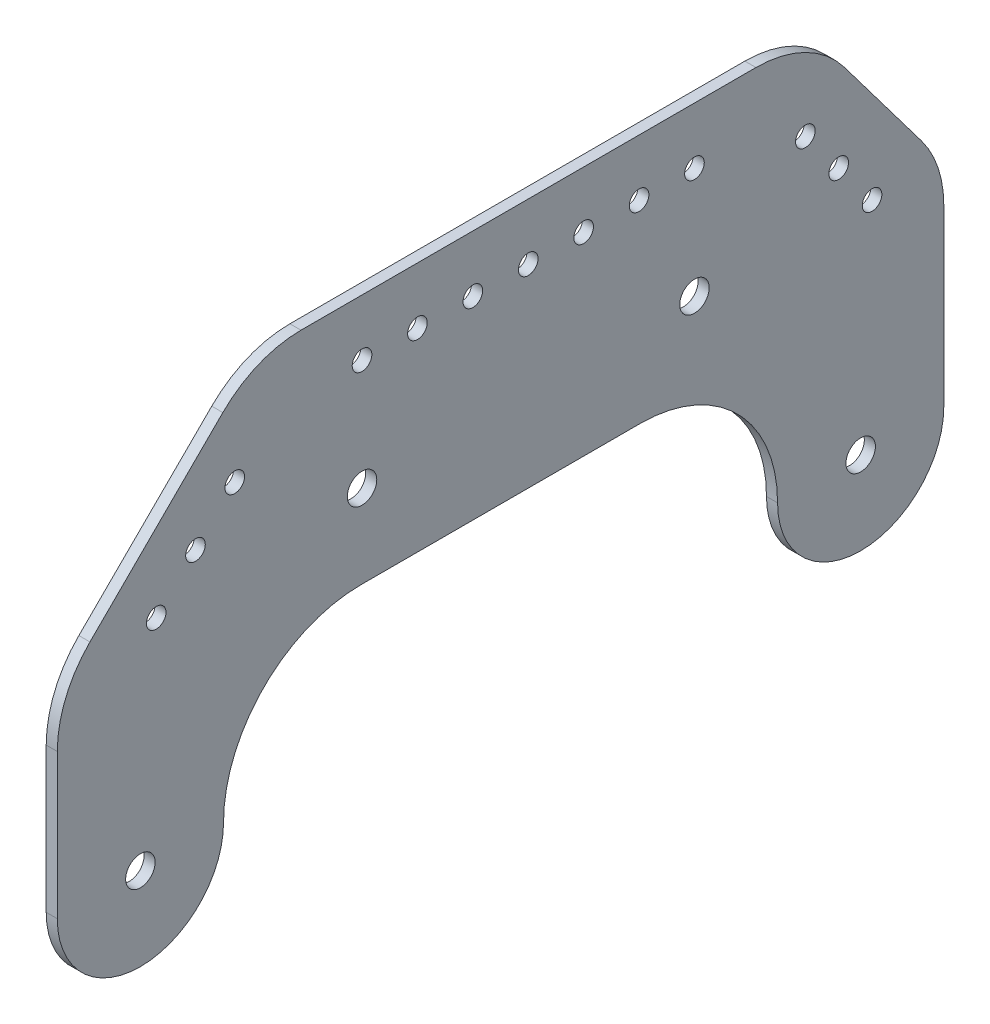
ISO-10303-21;
HEADER;
FILE_DESCRIPTION(('STEP AP214'),'2;1');
FILE_NAME('part.step','',(''),(''),'','','');
FILE_SCHEMA(('AUTOMOTIVE_DESIGN { 1 0 10303 214 1 1 1 1 }'));
ENDSEC;
DATA;
#1=APPLICATION_CONTEXT('core data for automotive mechanical design processes');
#2=APPLICATION_PROTOCOL_DEFINITION('international standard','automotive_design',2000,#1);
#3=PRODUCT_CONTEXT('',#1,'mechanical');
#4=PRODUCT('Part','Part','',(#3));
#5=PRODUCT_RELATED_PRODUCT_CATEGORY('part','',(#4));
#6=PRODUCT_DEFINITION_FORMATION('','',#4);
#7=PRODUCT_DEFINITION_CONTEXT('part definition',#1,'design');
#8=PRODUCT_DEFINITION('design','',#6,#7);
#9=PRODUCT_DEFINITION_SHAPE('','',#8);
#10=(LENGTH_UNIT() NAMED_UNIT(*) SI_UNIT(.MILLI.,.METRE.));
#11=(NAMED_UNIT(*) PLANE_ANGLE_UNIT() SI_UNIT($,.RADIAN.));
#12=(NAMED_UNIT(*) SI_UNIT($,.STERADIAN.) SOLID_ANGLE_UNIT());
#13=UNCERTAINTY_MEASURE_WITH_UNIT(LENGTH_MEASURE(1.E-05),#10,'distance_accuracy_value','');
#14=(GEOMETRIC_REPRESENTATION_CONTEXT(3) GLOBAL_UNCERTAINTY_ASSIGNED_CONTEXT((#13)) GLOBAL_UNIT_ASSIGNED_CONTEXT((#10,
#11,#12)) REPRESENTATION_CONTEXT('',''));
#15=CARTESIAN_POINT('',(0.,0.,0.));
#16=DIRECTION('',(0.,0.,1.));
#17=DIRECTION('',(1.,0.,0.));
#18=AXIS2_PLACEMENT_3D('',#15,#16,#17);
#19=CARTESIAN_POINT('',(0.,33.1917508430703,-6.34999999999999));
#20=DIRECTION('',(1.,0.,0.));
#21=DIRECTION('',(0.,0.,-1.));
#22=AXIS2_PLACEMENT_3D('',#19,#20,#21);
#23=PLANE('',#22);
#24=CARTESIAN_POINT('',(0.,75.946,-88.9));
#25=DIRECTION('',(1.,0.,0.));
#26=DIRECTION('',(0.,0.,-1.));
#27=AXIS2_PLACEMENT_3D('',#24,#25,#26);
#28=CIRCLE('',#27,2.2479);
#29=CARTESIAN_POINT('',(0.,75.946,-91.1479));
#30=VERTEX_POINT('',#29);
#31=EDGE_CURVE('E606',#30,#30,#28,.F.);
#32=ORIENTED_EDGE('',*,*,#31,.F.);
#33=EDGE_LOOP('',(#32));
#34=FACE_BOUND('',#33,.T.);
#35=CARTESIAN_POINT('',(0.,75.946,-101.6));
#36=DIRECTION('',(1.,0.,0.));
#37=DIRECTION('',(0.,0.,-1.));
#38=AXIS2_PLACEMENT_3D('',#35,#36,#37);
#39=CIRCLE('',#38,2.2479);
#40=CARTESIAN_POINT('',(0.,75.946,-103.8479));
#41=VERTEX_POINT('',#40);
#42=EDGE_CURVE('E612',#41,#41,#39,.F.);
#43=ORIENTED_EDGE('',*,*,#42,.F.);
#44=EDGE_LOOP('',(#43));
#45=FACE_BOUND('',#44,.T.);
#46=CARTESIAN_POINT('',(0.,48.3908890953049,-3.61982012414171));
#47=DIRECTION('',(1.,0.,0.));
#48=DIRECTION('',(0.,0.,-1.));
#49=AXIS2_PLACEMENT_3D('',#46,#47,#48);
#50=CIRCLE('',#49,2.2479);
#51=CARTESIAN_POINT('',(0.,48.3908890953049,-5.86772012414171));
#52=VERTEX_POINT('',#51);
#53=EDGE_CURVE('E630',#52,#52,#50,.F.);
#54=ORIENTED_EDGE('',*,*,#53,.F.);
#55=EDGE_LOOP('',(#54));
#56=FACE_BOUND('',#55,.T.);
#57=CARTESIAN_POINT('',(0.,69.5724765499946,-152.417846486706));
#58=DIRECTION('',(1.,0.,0.));
#59=DIRECTION('',(0.,0.,-1.));
#60=AXIS2_PLACEMENT_3D('',#57,#58,#59);
#61=CIRCLE('',#60,2.2479);
#62=CARTESIAN_POINT('',(0.,69.5724765499946,-154.665746486706));
#63=VERTEX_POINT('',#62);
#64=EDGE_CURVE('E637',#63,#63,#61,.F.);
#65=ORIENTED_EDGE('',*,*,#64,.F.);
#66=EDGE_LOOP('',(#65));
#67=FACE_BOUND('',#66,.T.);
#68=CARTESIAN_POINT('',(0.,59.4308526551306,-160.062286608462));
#69=DIRECTION('',(1.,0.,0.));
#70=DIRECTION('',(0.,0.,-1.));
#71=AXIS2_PLACEMENT_3D('',#68,#69,#70);
#72=CIRCLE('',#71,2.2479);
#73=CARTESIAN_POINT('',(0.,59.4308526551306,-162.310186608462));
#74=VERTEX_POINT('',#73);
#75=EDGE_CURVE('E643',#74,#74,#72,.F.);
#76=ORIENTED_EDGE('',*,*,#75,.F.);
#77=EDGE_LOOP('',(#76));
#78=FACE_BOUND('',#77,.T.);
#79=CARTESIAN_POINT('',(0.,49.2892287602667,-167.706726730219));
#80=DIRECTION('',(1.,0.,0.));
#81=DIRECTION('',(0.,0.,-1.));
#82=AXIS2_PLACEMENT_3D('',#79,#80,#81);
#83=CIRCLE('',#82,2.2479);
#84=CARTESIAN_POINT('',(0.,49.2892287602667,-169.954626730219));
#85=VERTEX_POINT('',#84);
#86=EDGE_CURVE('E649',#85,#85,#83,.F.);
#87=ORIENTED_EDGE('',*,*,#86,.F.);
#88=EDGE_LOOP('',(#87));
#89=FACE_BOUND('',#88,.T.);
#90=CARTESIAN_POINT('',(0.,75.946,-63.5));
#91=DIRECTION('',(1.,0.,0.));
#92=DIRECTION('',(0.,0.,-1.));
#93=AXIS2_PLACEMENT_3D('',#90,#91,#92);
#94=CIRCLE('',#93,2.2479);
#95=CARTESIAN_POINT('',(0.,75.946,-65.7479));
#96=VERTEX_POINT('',#95);
#97=EDGE_CURVE('E655',#96,#96,#94,.F.);
#98=ORIENTED_EDGE('',*,*,#97,.F.);
#99=EDGE_LOOP('',(#98));
#100=FACE_BOUND('',#99,.T.);
#101=CARTESIAN_POINT('',(0.,75.9460000000001,-50.8));
#102=DIRECTION('',(1.,0.,0.));
#103=DIRECTION('',(0.,0.,-1.));
#104=AXIS2_PLACEMENT_3D('',#101,#102,#103);
#105=CIRCLE('',#104,2.2479);
#106=CARTESIAN_POINT('',(0.,75.9460000000001,-53.0479));
#107=VERTEX_POINT('',#106);
#108=EDGE_CURVE('E661',#107,#107,#105,.F.);
#109=ORIENTED_EDGE('',*,*,#108,.F.);
#110=EDGE_LOOP('',(#109));
#111=FACE_BOUND('',#110,.T.);
#112=CARTESIAN_POINT('',(0.,75.946,-114.3));
#113=DIRECTION('',(1.,0.,0.));
#114=DIRECTION('',(0.,0.,-1.));
#115=AXIS2_PLACEMENT_3D('',#112,#113,#114);
#116=CIRCLE('',#115,2.2479);
#117=CARTESIAN_POINT('',(0.,75.946,-116.5479));
#118=VERTEX_POINT('',#117);
#119=EDGE_CURVE('E667',#118,#118,#116,.F.);
#120=ORIENTED_EDGE('',*,*,#119,.F.);
#121=EDGE_LOOP('',(#120));
#122=FACE_BOUND('',#121,.T.);
#123=CARTESIAN_POINT('',(0.,75.9460000000001,-127.));
#124=DIRECTION('',(1.,0.,0.));
#125=DIRECTION('',(0.,0.,-1.));
#126=AXIS2_PLACEMENT_3D('',#123,#124,#125);
#127=CIRCLE('',#126,2.2479);
#128=CARTESIAN_POINT('',(0.,75.9460000000001,-129.2479));
#129=VERTEX_POINT('',#128);
#130=EDGE_CURVE('E673',#129,#129,#127,.F.);
#131=ORIENTED_EDGE('',*,*,#130,.F.);
#132=EDGE_LOOP('',(#131));
#133=FACE_BOUND('',#132,.T.);
#134=CARTESIAN_POINT('',(0.,50.546,-50.8));
#135=DIRECTION('',(1.,0.,0.));
#136=DIRECTION('',(0.,0.,-1.));
#137=AXIS2_PLACEMENT_3D('',#134,#135,#136);
#138=CIRCLE('',#137,3.3782);
#139=CARTESIAN_POINT('',(0.,50.546,-54.1782));
#140=VERTEX_POINT('',#139);
#141=EDGE_CURVE('E681',#140,#140,#138,.T.);
#142=ORIENTED_EDGE('',*,*,#141,.T.);
#143=EDGE_LOOP('',(#142));
#144=FACE_BOUND('',#143,.T.);
#145=CARTESIAN_POINT('',(0.,50.546,-127.));
#146=DIRECTION('',(1.,0.,0.));
#147=DIRECTION('',(0.,0.,-1.));
#148=AXIS2_PLACEMENT_3D('',#145,#146,#147);
#149=CIRCLE('',#148,3.3782);
#150=CARTESIAN_POINT('',(0.,50.546,-130.3782));
#151=VERTEX_POINT('',#150);
#152=EDGE_CURVE('E689',#151,#151,#149,.T.);
#153=ORIENTED_EDGE('',*,*,#152,.T.);
#154=EDGE_LOOP('',(#153));
#155=FACE_BOUND('',#154,.T.);
#156=CARTESIAN_POINT('',(0.,1.38777878078145E-13,-165.1));
#157=DIRECTION('',(1.,0.,0.));
#158=DIRECTION('',(0.,0.,-1.));
#159=AXIS2_PLACEMENT_3D('',#156,#157,#158);
#160=CIRCLE('',#159,3.3782);
#161=CARTESIAN_POINT('',(0.,1.38777878078145E-13,-168.4782));
#162=VERTEX_POINT('',#161);
#163=EDGE_CURVE('E695',#162,#162,#160,.T.);
#164=ORIENTED_EDGE('',*,*,#163,.T.);
#165=EDGE_LOOP('',(#164));
#166=FACE_BOUND('',#165,.T.);
#167=CARTESIAN_POINT('',(0.,0.,0.));
#168=DIRECTION('',(1.,0.,0.));
#169=DIRECTION('',(0.,0.,-1.));
#170=AXIS2_PLACEMENT_3D('',#167,#168,#169);
#171=CIRCLE('',#170,3.3782);
#172=CARTESIAN_POINT('',(0.,0.,-3.3782));
#173=VERTEX_POINT('',#172);
#174=EDGE_CURVE('E184',#173,#173,#171,.T.);
#175=ORIENTED_EDGE('',*,*,#174,.T.);
#176=EDGE_LOOP('',(#175));
#177=FACE_BOUND('',#176,.T.);
#178=DIRECTION('',(0.,1.,0.));
#179=VECTOR('',#178,1.);
#180=CARTESIAN_POINT('',(0.,0.,19.05));
#181=LINE('',#180,#179);
#182=CARTESIAN_POINT('',(0.,0.,19.05));
#183=VERTEX_POINT('',#182);
#184=CARTESIAN_POINT('',(0.,33.1917508430702,19.05));
#185=VERTEX_POINT('',#184);
#186=EDGE_CURVE('E180',#183,#185,#181,.T.);
#187=ORIENTED_EDGE('',*,*,#186,.T.);
#188=CARTESIAN_POINT('',(0.,33.1917508430703,-6.34999999999999));
#189=DIRECTION('',(1.,0.,0.));
#190=DIRECTION('',(0.,0.,-1.));
#191=AXIS2_PLACEMENT_3D('',#188,#189,#190);
#192=CIRCLE('',#191,25.4);
#193=CARTESIAN_POINT('',(0.,51.1972203509545,11.5654421603446));
#194=VERTEX_POINT('',#193);
#195=EDGE_CURVE('E183',#194,#185,#192,.T.);
#196=ORIENTED_EDGE('',*,*,#195,.F.);
#197=DIRECTION('',(0.,0.705332368517507,-0.708876752278902));
#198=VECTOR('',#197,1.);
#199=CARTESIAN_POINT('',(0.,51.1972203509545,11.5654421603446));
#200=LINE('',#199,#198);
#201=CARTESIAN_POINT('',(0.,81.505469507884,-18.8951097561674));
#202=VERTEX_POINT('',#201);
#203=EDGE_CURVE('E187',#194,#202,#200,.T.);
#204=ORIENTED_EDGE('',*,*,#203,.T.);
#205=CARTESIAN_POINT('',(0.,63.5,-36.8105519165122));
#206=DIRECTION('',(-1.,0.,0.));
#207=DIRECTION('',(0.,0.,1.));
#208=AXIS2_PLACEMENT_3D('',#205,#206,#207);
#209=CIRCLE('',#208,25.4);
#210=CARTESIAN_POINT('',(0.,88.9,-36.8105519165123));
#211=VERTEX_POINT('',#210);
#212=EDGE_CURVE('E190',#202,#211,#209,.T.);
#213=ORIENTED_EDGE('',*,*,#212,.T.);
#214=DIRECTION('',(0.,0.,-1.));
#215=VECTOR('',#214,1.);
#216=CARTESIAN_POINT('',(0.,88.9,-36.8105519165123));
#217=LINE('',#216,#215);
#218=CARTESIAN_POINT('',(0.,88.9,-141.091325427197));
#219=VERTEX_POINT('',#218);
#220=EDGE_CURVE('E193',#211,#219,#217,.T.);
#221=ORIENTED_EDGE('',*,*,#220,.T.);
#222=CARTESIAN_POINT('',(0.,63.5,-141.091325427197));
#223=DIRECTION('',(1.,0.,0.));
#224=DIRECTION('',(0.,0.,-1.));
#225=AXIS2_PLACEMENT_3D('',#222,#223,#224);
#226=CIRCLE('',#225,25.4);
#227=CARTESIAN_POINT('',(0.,78.7888802435134,-161.374573216925));
#228=VERTEX_POINT('',#227);
#229=EDGE_CURVE('E196',#228,#219,#226,.T.);
#230=ORIENTED_EDGE('',*,*,#229,.F.);
#231=DIRECTION('',(0.,-0.798553062587712,-0.601924419035966));
#232=VECTOR('',#231,1.);
#233=CARTESIAN_POINT('',(0.,78.7888802435134,-161.374573216925));
#234=LINE('',#233,#232);
#235=CARTESIAN_POINT('',(0.,55.3617053102614,-179.033247789728));
#236=VERTEX_POINT('',#235);
#237=EDGE_CURVE('E199',#228,#236,#234,.T.);
#238=ORIENTED_EDGE('',*,*,#237,.T.);
#239=CARTESIAN_POINT('',(0.,40.0728250667478,-158.75));
#240=DIRECTION('',(-1.,0.,0.));
#241=DIRECTION('',(0.,0.,1.));
#242=AXIS2_PLACEMENT_3D('',#239,#240,#241);
#243=CIRCLE('',#242,25.4);
#244=CARTESIAN_POINT('',(0.,40.0728250667477,-184.15));
#245=VERTEX_POINT('',#244);
#246=EDGE_CURVE('E202',#236,#245,#243,.T.);
#247=ORIENTED_EDGE('',*,*,#246,.T.);
#248=DIRECTION('',(0.,-1.,0.));
#249=VECTOR('',#248,1.);
#250=CARTESIAN_POINT('',(0.,40.0728250667477,-184.15));
#251=LINE('',#250,#249);
#252=CARTESIAN_POINT('',(0.,1.38777878078145E-13,-184.15));
#253=VERTEX_POINT('',#252);
#254=EDGE_CURVE('E205',#245,#253,#251,.T.);
#255=ORIENTED_EDGE('',*,*,#254,.T.);
#256=CARTESIAN_POINT('',(0.,1.38777878078145E-13,-165.1));
#257=DIRECTION('',(1.,0.,0.));
#258=DIRECTION('',(0.,0.,-1.));
#259=AXIS2_PLACEMENT_3D('',#256,#257,#258);
#260=CIRCLE('',#259,19.05);
#261=CARTESIAN_POINT('',(0.,0.,-146.05));
#262=VERTEX_POINT('',#261);
#263=EDGE_CURVE('E208',#262,#253,#260,.T.);
#264=ORIENTED_EDGE('',*,*,#263,.F.);
#265=CARTESIAN_POINT('',(0.,-2.61325812841072E-13,-114.554));
#266=DIRECTION('',(1.,0.,0.));
#267=DIRECTION('',(0.,0.,-1.));
#268=AXIS2_PLACEMENT_3D('',#265,#266,#267);
#269=CIRCLE('',#268,31.4960000000003);
#270=CARTESIAN_POINT('',(0.,31.496,-114.554));
#271=VERTEX_POINT('',#270);
#272=EDGE_CURVE('E212',#262,#271,#269,.T.);
#273=ORIENTED_EDGE('',*,*,#272,.T.);
#274=DIRECTION('',(0.,0.,-1.));
#275=VECTOR('',#274,1.);
#276=CARTESIAN_POINT('',(0.,31.496,-50.546));
#277=LINE('',#276,#275);
#278=CARTESIAN_POINT('',(0.,31.496,-50.546));
#279=VERTEX_POINT('',#278);
#280=EDGE_CURVE('E216',#279,#271,#277,.T.);
#281=ORIENTED_EDGE('',*,*,#280,.F.);
#282=CARTESIAN_POINT('',(0.,0.,-50.546));
#283=DIRECTION('',(1.,0.,0.));
#284=DIRECTION('',(0.,0.,-1.));
#285=AXIS2_PLACEMENT_3D('',#282,#283,#284);
#286=CIRCLE('',#285,31.496);
#287=CARTESIAN_POINT('',(0.,0.,-19.05));
#288=VERTEX_POINT('',#287);
#289=EDGE_CURVE('E157',#279,#288,#286,.T.);
#290=ORIENTED_EDGE('',*,*,#289,.T.);
#291=CARTESIAN_POINT('',(0.,0.,0.));
#292=DIRECTION('',(1.,0.,0.));
#293=DIRECTION('',(0.,0.,-1.));
#294=AXIS2_PLACEMENT_3D('',#291,#292,#293);
#295=CIRCLE('',#294,19.05);
#296=EDGE_CURVE('E220',#183,#288,#295,.T.);
#297=ORIENTED_EDGE('',*,*,#296,.F.);
#298=EDGE_LOOP('',(#187,#196,#204,#213,#221,#230,#238,#247,#255,#264,#273,#281,#290,#297));
#299=FACE_BOUND('',#298,.T.);
#300=CARTESIAN_POINT('',(0.,57.3486101754772,-12.6225548780838));
#301=DIRECTION('',(1.,0.,0.));
#302=DIRECTION('',(0.,0.,-1.));
#303=AXIS2_PLACEMENT_3D('',#300,#301,#302);
#304=CIRCLE('',#303,2.2479);
#305=CARTESIAN_POINT('',(0.,57.3486101754772,-14.8704548780838));
#306=VERTEX_POINT('',#305);
#307=EDGE_CURVE('E624',#306,#306,#304,.F.);
#308=ORIENTED_EDGE('',*,*,#307,.F.);
#309=EDGE_LOOP('',(#308));
#310=FACE_BOUND('',#309,.T.);
#311=CARTESIAN_POINT('',(0.,66.3063312556496,-21.6252896320258));
#312=DIRECTION('',(1.,0.,0.));
#313=DIRECTION('',(0.,0.,-1.));
#314=AXIS2_PLACEMENT_3D('',#311,#312,#313);
#315=CIRCLE('',#314,2.2479);
#316=CARTESIAN_POINT('',(0.,66.3063312556496,-23.8731896320258));
#317=VERTEX_POINT('',#316);
#318=EDGE_CURVE('E618',#317,#317,#315,.F.);
#319=ORIENTED_EDGE('',*,*,#318,.F.);
#320=EDGE_LOOP('',(#319));
#321=FACE_BOUND('',#320,.T.);
#322=CARTESIAN_POINT('',(0.,75.946,-76.2));
#323=DIRECTION('',(1.,0.,0.));
#324=DIRECTION('',(0.,0.,-1.));
#325=AXIS2_PLACEMENT_3D('',#322,#323,#324);
#326=CIRCLE('',#325,2.2479);
#327=CARTESIAN_POINT('',(0.,75.946,-78.4479));
#328=VERTEX_POINT('',#327);
#329=EDGE_CURVE('E598',#328,#328,#326,.F.);
#330=ORIENTED_EDGE('',*,*,#329,.F.);
#331=EDGE_LOOP('',(#330));
#332=FACE_BOUND('',#331,.T.);
#333=ADVANCED_FACE('F41',(#34,#45,#56,#67,#78,#89,#100,#111,#122,#133,#144,#155,#166,#177,#299,
#310,#321,#332),#23,.F.);
#334=CARTESIAN_POINT('',(2.54,0.,19.05));
#335=DIRECTION('',(0.,0.,1.));
#336=DIRECTION('',(1.,0.,0.));
#337=AXIS2_PLACEMENT_3D('',#334,#335,#336);
#338=PLANE('',#337);
#339=ORIENTED_EDGE('',*,*,#186,.F.);
#340=DIRECTION('',(-1.,0.,0.));
#341=VECTOR('',#340,1.);
#342=CARTESIAN_POINT('',(2.54,0.,19.05));
#343=LINE('',#342,#341);
#344=CARTESIAN_POINT('',(2.54,0.,19.05));
#345=VERTEX_POINT('',#344);
#346=EDGE_CURVE('E11',#345,#183,#343,.T.);
#347=ORIENTED_EDGE('',*,*,#346,.F.);
#348=DIRECTION('',(0.,1.,0.));
#349=VECTOR('',#348,1.);
#350=CARTESIAN_POINT('',(2.54,0.,19.05));
#351=LINE('',#350,#349);
#352=CARTESIAN_POINT('',(2.54,33.1917508430702,19.05));
#353=VERTEX_POINT('',#352);
#354=EDGE_CURVE('E221',#345,#353,#351,.T.);
#355=ORIENTED_EDGE('',*,*,#354,.T.);
#356=DIRECTION('',(-1.,0.,0.));
#357=VECTOR('',#356,1.);
#358=CARTESIAN_POINT('',(2.54,33.1917508430702,19.05));
#359=LINE('',#358,#357);
#360=EDGE_CURVE('E45',#353,#185,#359,.T.);
#361=ORIENTED_EDGE('',*,*,#360,.T.);
#362=EDGE_LOOP('',(#339,#347,#355,#361));
#363=FACE_BOUND('',#362,.T.);
#364=ADVANCED_FACE('F43',(#363),#338,.T.);
#365=CARTESIAN_POINT('',(2.54,0.,0.));
#366=DIRECTION('',(-1.,0.,0.));
#367=DIRECTION('',(0.,0.,1.));
#368=AXIS2_PLACEMENT_3D('',#365,#366,#367);
#369=CYLINDRICAL_SURFACE('',#368,19.05);
#370=ORIENTED_EDGE('',*,*,#296,.T.);
#371=DIRECTION('',(-1.,0.,0.));
#372=VECTOR('',#371,1.);
#373=CARTESIAN_POINT('',(2.54,0.,-19.05));
#374=LINE('',#373,#372);
#375=CARTESIAN_POINT('',(2.54,0.,-19.05));
#376=VERTEX_POINT('',#375);
#377=EDGE_CURVE('E51',#376,#288,#374,.T.);
#378=ORIENTED_EDGE('',*,*,#377,.F.);
#379=CARTESIAN_POINT('',(2.54,0.,0.));
#380=DIRECTION('',(1.,0.,0.));
#381=DIRECTION('',(0.,0.,-1.));
#382=AXIS2_PLACEMENT_3D('',#379,#380,#381);
#383=CIRCLE('',#382,19.05);
#384=EDGE_CURVE('E171',#345,#376,#383,.T.);
#385=ORIENTED_EDGE('',*,*,#384,.F.);
#386=ORIENTED_EDGE('',*,*,#346,.T.);
#387=EDGE_LOOP('',(#370,#378,#385,#386));
#388=FACE_BOUND('',#387,.T.);
#389=ADVANCED_FACE('F248',(#388),#369,.T.);
#390=CARTESIAN_POINT('',(2.54,0.,-50.546));
#391=DIRECTION('',(-1.,0.,0.));
#392=DIRECTION('',(0.,0.,1.));
#393=AXIS2_PLACEMENT_3D('',#390,#391,#392);
#394=CYLINDRICAL_SURFACE('',#393,31.496);
#395=ORIENTED_EDGE('',*,*,#289,.F.);
#396=DIRECTION('',(-1.,0.,0.));
#397=VECTOR('',#396,1.);
#398=CARTESIAN_POINT('',(2.54,31.496,-50.546));
#399=LINE('',#398,#397);
#400=CARTESIAN_POINT('',(2.54,31.496,-50.546));
#401=VERTEX_POINT('',#400);
#402=EDGE_CURVE('E151',#401,#279,#399,.T.);
#403=ORIENTED_EDGE('',*,*,#402,.F.);
#404=CARTESIAN_POINT('',(2.54,0.,-50.546));
#405=DIRECTION('',(1.,0.,0.));
#406=DIRECTION('',(0.,0.,-1.));
#407=AXIS2_PLACEMENT_3D('',#404,#405,#406);
#408=CIRCLE('',#407,31.496);
#409=EDGE_CURVE('E155',#401,#376,#408,.T.);
#410=ORIENTED_EDGE('',*,*,#409,.T.);
#411=ORIENTED_EDGE('',*,*,#377,.T.);
#412=EDGE_LOOP('',(#395,#403,#410,#411));
#413=FACE_BOUND('',#412,.T.);
#414=ADVANCED_FACE('F153',(#413),#394,.F.);
#415=CARTESIAN_POINT('',(2.54,31.496,-50.546));
#416=DIRECTION('',(0.,1.,0.));
#417=DIRECTION('',(0.,0.,1.));
#418=AXIS2_PLACEMENT_3D('',#415,#416,#417);
#419=PLANE('',#418);
#420=ORIENTED_EDGE('',*,*,#280,.T.);
#421=DIRECTION('',(-1.,0.,0.));
#422=VECTOR('',#421,1.);
#423=CARTESIAN_POINT('',(2.54,31.496,-114.554));
#424=LINE('',#423,#422);
#425=CARTESIAN_POINT('',(2.54,31.496,-114.554));
#426=VERTEX_POINT('',#425);
#427=EDGE_CURVE('E161',#426,#271,#424,.T.);
#428=ORIENTED_EDGE('',*,*,#427,.F.);
#429=DIRECTION('',(0.,0.,-1.));
#430=VECTOR('',#429,1.);
#431=CARTESIAN_POINT('',(2.54,31.496,-50.546));
#432=LINE('',#431,#430);
#433=EDGE_CURVE('E164',#401,#426,#432,.T.);
#434=ORIENTED_EDGE('',*,*,#433,.F.);
#435=ORIENTED_EDGE('',*,*,#402,.T.);
#436=EDGE_LOOP('',(#420,#428,#434,#435));
#437=FACE_BOUND('',#436,.T.);
#438=ADVANCED_FACE('F165',(#437),#419,.F.);
#439=CARTESIAN_POINT('',(2.54,-2.61325812841072E-13,-114.554));
#440=DIRECTION('',(-1.,0.,0.));
#441=DIRECTION('',(0.,0.,1.));
#442=AXIS2_PLACEMENT_3D('',#439,#440,#441);
#443=CYLINDRICAL_SURFACE('',#442,31.4960000000003);
#444=ORIENTED_EDGE('',*,*,#272,.F.);
#445=DIRECTION('',(-1.,0.,0.));
#446=VECTOR('',#445,1.);
#447=CARTESIAN_POINT('',(2.54,0.,-146.05));
#448=LINE('',#447,#446);
#449=CARTESIAN_POINT('',(2.54,0.,-146.05));
#450=VERTEX_POINT('',#449);
#451=EDGE_CURVE('E225',#450,#262,#448,.T.);
#452=ORIENTED_EDGE('',*,*,#451,.F.);
#453=CARTESIAN_POINT('',(2.54,-2.61325812841072E-13,-114.554));
#454=DIRECTION('',(1.,0.,0.));
#455=DIRECTION('',(0.,0.,-1.));
#456=AXIS2_PLACEMENT_3D('',#453,#454,#455);
#457=CIRCLE('',#456,31.4960000000003);
#458=EDGE_CURVE('E168',#450,#426,#457,.T.);
#459=ORIENTED_EDGE('',*,*,#458,.T.);
#460=ORIENTED_EDGE('',*,*,#427,.T.);
#461=EDGE_LOOP('',(#444,#452,#459,#460));
#462=FACE_BOUND('',#461,.T.);
#463=ADVANCED_FACE('F281',(#462),#443,.F.);
#464=CARTESIAN_POINT('',(2.54,1.38777878078145E-13,-165.1));
#465=DIRECTION('',(-1.,0.,0.));
#466=DIRECTION('',(0.,0.,1.));
#467=AXIS2_PLACEMENT_3D('',#464,#465,#466);
#468=CYLINDRICAL_SURFACE('',#467,19.05);
#469=ORIENTED_EDGE('',*,*,#263,.T.);
#470=DIRECTION('',(-1.,0.,0.));
#471=VECTOR('',#470,1.);
#472=CARTESIAN_POINT('',(2.54,1.38777878078145E-13,-184.15));
#473=LINE('',#472,#471);
#474=CARTESIAN_POINT('',(2.54,1.38777878078145E-13,-184.15));
#475=VERTEX_POINT('',#474);
#476=EDGE_CURVE('E228',#475,#253,#473,.T.);
#477=ORIENTED_EDGE('',*,*,#476,.F.);
#478=CARTESIAN_POINT('',(2.54,1.38777878078145E-13,-165.1));
#479=DIRECTION('',(1.,0.,0.));
#480=DIRECTION('',(0.,0.,-1.));
#481=AXIS2_PLACEMENT_3D('',#478,#479,#480);
#482=CIRCLE('',#481,19.05);
#483=EDGE_CURVE('E274',#450,#475,#482,.T.);
#484=ORIENTED_EDGE('',*,*,#483,.F.);
#485=ORIENTED_EDGE('',*,*,#451,.T.);
#486=EDGE_LOOP('',(#469,#477,#484,#485));
#487=FACE_BOUND('',#486,.T.);
#488=ADVANCED_FACE('F287',(#487),#468,.T.);
#489=CARTESIAN_POINT('',(2.54,40.0728250667477,-184.15));
#490=DIRECTION('',(0.,0.,-1.));
#491=DIRECTION('',(0.,1.,0.));
#492=AXIS2_PLACEMENT_3D('',#489,#490,#491);
#493=PLANE('',#492);
#494=ORIENTED_EDGE('',*,*,#254,.F.);
#495=DIRECTION('',(-1.,0.,0.));
#496=VECTOR('',#495,1.);
#497=CARTESIAN_POINT('',(2.54,40.0728250667477,-184.15));
#498=LINE('',#497,#496);
#499=CARTESIAN_POINT('',(2.54,40.0728250667477,-184.15));
#500=VERTEX_POINT('',#499);
#501=EDGE_CURVE('E230',#500,#245,#498,.T.);
#502=ORIENTED_EDGE('',*,*,#501,.F.);
#503=DIRECTION('',(0.,-1.,0.));
#504=VECTOR('',#503,1.);
#505=CARTESIAN_POINT('',(2.54,40.0728250667477,-184.15));
#506=LINE('',#505,#504);
#507=EDGE_CURVE('E271',#500,#475,#506,.T.);
#508=ORIENTED_EDGE('',*,*,#507,.T.);
#509=ORIENTED_EDGE('',*,*,#476,.T.);
#510=EDGE_LOOP('',(#494,#502,#508,#509));
#511=FACE_BOUND('',#510,.T.);
#512=ADVANCED_FACE('F291',(#511),#493,.T.);
#513=CARTESIAN_POINT('',(2.54,40.0728250667478,-158.75));
#514=DIRECTION('',(-1.,0.,0.));
#515=DIRECTION('',(0.,0.,1.));
#516=AXIS2_PLACEMENT_3D('',#513,#514,#515);
#517=CYLINDRICAL_SURFACE('',#516,25.4);
#518=ORIENTED_EDGE('',*,*,#246,.F.);
#519=DIRECTION('',(-1.,0.,0.));
#520=VECTOR('',#519,1.);
#521=CARTESIAN_POINT('',(2.54,55.3617053102614,-179.033247789728));
#522=LINE('',#521,#520);
#523=CARTESIAN_POINT('',(2.54,55.3617053102614,-179.033247789728));
#524=VERTEX_POINT('',#523);
#525=EDGE_CURVE('E232',#524,#236,#522,.T.);
#526=ORIENTED_EDGE('',*,*,#525,.F.);
#527=CARTESIAN_POINT('',(2.54,40.0728250667478,-158.75));
#528=DIRECTION('',(-1.,0.,0.));
#529=DIRECTION('',(0.,0.,1.));
#530=AXIS2_PLACEMENT_3D('',#527,#528,#529);
#531=CIRCLE('',#530,25.4);
#532=EDGE_CURVE('E268',#524,#500,#531,.T.);
#533=ORIENTED_EDGE('',*,*,#532,.T.);
#534=ORIENTED_EDGE('',*,*,#501,.T.);
#535=EDGE_LOOP('',(#518,#526,#533,#534));
#536=FACE_BOUND('',#535,.T.);
#537=ADVANCED_FACE('F294',(#536),#517,.T.);
#538=CARTESIAN_POINT('',(2.54,78.7888802435134,-161.374573216925));
#539=DIRECTION('',(0.,0.601924419035966,-0.798553062587712));
#540=DIRECTION('',(0.,0.798553062587712,0.601924419035966));
#541=AXIS2_PLACEMENT_3D('',#538,#539,#540);
#542=PLANE('',#541);
#543=ORIENTED_EDGE('',*,*,#237,.F.);
#544=DIRECTION('',(-1.,0.,0.));
#545=VECTOR('',#544,1.);
#546=CARTESIAN_POINT('',(2.54,78.7888802435134,-161.374573216925));
#547=LINE('',#546,#545);
#548=CARTESIAN_POINT('',(2.54,78.7888802435134,-161.374573216925));
#549=VERTEX_POINT('',#548);
#550=EDGE_CURVE('E234',#549,#228,#547,.T.);
#551=ORIENTED_EDGE('',*,*,#550,.F.);
#552=DIRECTION('',(0.,-0.798553062587712,-0.601924419035966));
#553=VECTOR('',#552,1.);
#554=CARTESIAN_POINT('',(2.54,78.7888802435134,-161.374573216925));
#555=LINE('',#554,#553);
#556=EDGE_CURVE('E265',#549,#524,#555,.T.);
#557=ORIENTED_EDGE('',*,*,#556,.T.);
#558=ORIENTED_EDGE('',*,*,#525,.T.);
#559=EDGE_LOOP('',(#543,#551,#557,#558));
#560=FACE_BOUND('',#559,.T.);
#561=ADVANCED_FACE('F298',(#560),#542,.T.);
#562=CARTESIAN_POINT('',(2.54,63.5,-141.091325427197));
#563=DIRECTION('',(-1.,0.,0.));
#564=DIRECTION('',(0.,0.,1.));
#565=AXIS2_PLACEMENT_3D('',#562,#563,#564);
#566=CYLINDRICAL_SURFACE('',#565,25.4);
#567=ORIENTED_EDGE('',*,*,#229,.T.);
#568=DIRECTION('',(-1.,0.,0.));
#569=VECTOR('',#568,1.);
#570=CARTESIAN_POINT('',(2.54,88.9,-141.091325427197));
#571=LINE('',#570,#569);
#572=CARTESIAN_POINT('',(2.54,88.9,-141.091325427197));
#573=VERTEX_POINT('',#572);
#574=EDGE_CURVE('E236',#573,#219,#571,.T.);
#575=ORIENTED_EDGE('',*,*,#574,.F.);
#576=CARTESIAN_POINT('',(2.54,63.5,-141.091325427197));
#577=DIRECTION('',(1.,0.,0.));
#578=DIRECTION('',(0.,0.,-1.));
#579=AXIS2_PLACEMENT_3D('',#576,#577,#578);
#580=CIRCLE('',#579,25.4);
#581=EDGE_CURVE('E263',#549,#573,#580,.T.);
#582=ORIENTED_EDGE('',*,*,#581,.F.);
#583=ORIENTED_EDGE('',*,*,#550,.T.);
#584=EDGE_LOOP('',(#567,#575,#582,#583));
#585=FACE_BOUND('',#584,.T.);
#586=ADVANCED_FACE('F303',(#585),#566,.T.);
#587=CARTESIAN_POINT('',(2.54,88.9,-36.8105519165123));
#588=DIRECTION('',(0.,1.,0.));
#589=DIRECTION('',(0.,0.,1.));
#590=AXIS2_PLACEMENT_3D('',#587,#588,#589);
#591=PLANE('',#590);
#592=ORIENTED_EDGE('',*,*,#220,.F.);
#593=DIRECTION('',(-1.,0.,0.));
#594=VECTOR('',#593,1.);
#595=CARTESIAN_POINT('',(2.54,88.9,-36.8105519165123));
#596=LINE('',#595,#594);
#597=CARTESIAN_POINT('',(2.54,88.9,-36.8105519165123));
#598=VERTEX_POINT('',#597);
#599=EDGE_CURVE('E238',#598,#211,#596,.T.);
#600=ORIENTED_EDGE('',*,*,#599,.F.);
#601=DIRECTION('',(0.,0.,-1.));
#602=VECTOR('',#601,1.);
#603=CARTESIAN_POINT('',(2.54,88.9,-36.8105519165123));
#604=LINE('',#603,#602);
#605=EDGE_CURVE('E260',#598,#573,#604,.T.);
#606=ORIENTED_EDGE('',*,*,#605,.T.);
#607=ORIENTED_EDGE('',*,*,#574,.T.);
#608=EDGE_LOOP('',(#592,#600,#606,#607));
#609=FACE_BOUND('',#608,.T.);
#610=ADVANCED_FACE('F313',(#609),#591,.T.);
#611=CARTESIAN_POINT('',(2.54,63.5,-36.8105519165122));
#612=DIRECTION('',(-1.,0.,0.));
#613=DIRECTION('',(0.,0.,1.));
#614=AXIS2_PLACEMENT_3D('',#611,#612,#613);
#615=CYLINDRICAL_SURFACE('',#614,25.4);
#616=ORIENTED_EDGE('',*,*,#212,.F.);
#617=DIRECTION('',(-1.,0.,0.));
#618=VECTOR('',#617,1.);
#619=CARTESIAN_POINT('',(2.54,81.505469507884,-18.8951097561674));
#620=LINE('',#619,#618);
#621=CARTESIAN_POINT('',(2.54,81.505469507884,-18.8951097561674));
#622=VERTEX_POINT('',#621);
#623=EDGE_CURVE('E240',#622,#202,#620,.T.);
#624=ORIENTED_EDGE('',*,*,#623,.F.);
#625=CARTESIAN_POINT('',(2.54,63.5,-36.8105519165122));
#626=DIRECTION('',(-1.,0.,0.));
#627=DIRECTION('',(0.,0.,1.));
#628=AXIS2_PLACEMENT_3D('',#625,#626,#627);
#629=CIRCLE('',#628,25.4);
#630=EDGE_CURVE('E257',#622,#598,#629,.T.);
#631=ORIENTED_EDGE('',*,*,#630,.T.);
#632=ORIENTED_EDGE('',*,*,#599,.T.);
#633=EDGE_LOOP('',(#616,#624,#631,#632));
#634=FACE_BOUND('',#633,.T.);
#635=ADVANCED_FACE('F309',(#634),#615,.T.);
#636=CARTESIAN_POINT('',(2.54,51.1972203509545,11.5654421603446));
#637=DIRECTION('',(0.,0.708876752278902,0.705332368517507));
#638=DIRECTION('',(0.,-0.705332368517507,0.708876752278902));
#639=AXIS2_PLACEMENT_3D('',#636,#637,#638);
#640=PLANE('',#639);
#641=ORIENTED_EDGE('',*,*,#203,.F.);
#642=DIRECTION('',(-1.,0.,0.));
#643=VECTOR('',#642,1.);
#644=CARTESIAN_POINT('',(2.54,51.1972203509545,11.5654421603446));
#645=LINE('',#644,#643);
#646=CARTESIAN_POINT('',(2.54,51.1972203509545,11.5654421603446));
#647=VERTEX_POINT('',#646);
#648=EDGE_CURVE('E241',#647,#194,#645,.T.);
#649=ORIENTED_EDGE('',*,*,#648,.F.);
#650=DIRECTION('',(0.,0.705332368517507,-0.708876752278902));
#651=VECTOR('',#650,1.);
#652=CARTESIAN_POINT('',(2.54,51.1972203509545,11.5654421603446));
#653=LINE('',#652,#651);
#654=EDGE_CURVE('E250',#647,#622,#653,.T.);
#655=ORIENTED_EDGE('',*,*,#654,.T.);
#656=ORIENTED_EDGE('',*,*,#623,.T.);
#657=EDGE_LOOP('',(#641,#649,#655,#656));
#658=FACE_BOUND('',#657,.T.);
#659=ADVANCED_FACE('F312',(#658),#640,.T.);
#660=CARTESIAN_POINT('',(2.54,33.1917508430703,-6.34999999999999));
#661=DIRECTION('',(-1.,0.,0.));
#662=DIRECTION('',(0.,0.,1.));
#663=AXIS2_PLACEMENT_3D('',#660,#661,#662);
#664=CYLINDRICAL_SURFACE('',#663,25.4);
#665=ORIENTED_EDGE('',*,*,#195,.T.);
#666=ORIENTED_EDGE('',*,*,#360,.F.);
#667=CARTESIAN_POINT('',(2.54,33.1917508430703,-6.34999999999999));
#668=DIRECTION('',(1.,0.,0.));
#669=DIRECTION('',(0.,0.,-1.));
#670=AXIS2_PLACEMENT_3D('',#667,#668,#669);
#671=CIRCLE('',#670,25.4);
#672=EDGE_CURVE('E118',#647,#353,#671,.T.);
#673=ORIENTED_EDGE('',*,*,#672,.F.);
#674=ORIENTED_EDGE('',*,*,#648,.T.);
#675=EDGE_LOOP('',(#665,#666,#673,#674));
#676=FACE_BOUND('',#675,.T.);
#677=ADVANCED_FACE('F244',(#676),#664,.T.);
#678=CARTESIAN_POINT('',(2.54,33.1917508430703,-6.34999999999999));
#679=DIRECTION('',(1.,0.,0.));
#680=DIRECTION('',(0.,0.,-1.));
#681=AXIS2_PLACEMENT_3D('',#678,#679,#680);
#682=PLANE('',#681);
#683=CARTESIAN_POINT('',(2.54,75.946,-76.2));
#684=DIRECTION('',(1.,0.,0.));
#685=DIRECTION('',(0.,0.,-1.));
#686=AXIS2_PLACEMENT_3D('',#683,#684,#685);
#687=CIRCLE('',#686,2.2479);
#688=CARTESIAN_POINT('',(2.54,75.946,-78.4479));
#689=VERTEX_POINT('',#688);
#690=EDGE_CURVE('E601',#689,#689,#687,.T.);
#691=ORIENTED_EDGE('',*,*,#690,.F.);
#692=EDGE_LOOP('',(#691));
#693=FACE_BOUND('',#692,.T.);
#694=CARTESIAN_POINT('',(2.54,75.946,-88.9));
#695=DIRECTION('',(1.,0.,0.));
#696=DIRECTION('',(0.,0.,-1.));
#697=AXIS2_PLACEMENT_3D('',#694,#695,#696);
#698=CIRCLE('',#697,2.2479);
#699=CARTESIAN_POINT('',(2.54,75.946,-91.1479));
#700=VERTEX_POINT('',#699);
#701=EDGE_CURVE('E603',#700,#700,#698,.T.);
#702=ORIENTED_EDGE('',*,*,#701,.F.);
#703=EDGE_LOOP('',(#702));
#704=FACE_BOUND('',#703,.T.);
#705=CARTESIAN_POINT('',(2.54,75.946,-101.6));
#706=DIRECTION('',(1.,0.,0.));
#707=DIRECTION('',(0.,0.,-1.));
#708=AXIS2_PLACEMENT_3D('',#705,#706,#707);
#709=CIRCLE('',#708,2.2479);
#710=CARTESIAN_POINT('',(2.54,75.946,-103.8479));
#711=VERTEX_POINT('',#710);
#712=EDGE_CURVE('E609',#711,#711,#709,.T.);
#713=ORIENTED_EDGE('',*,*,#712,.F.);
#714=EDGE_LOOP('',(#713));
#715=FACE_BOUND('',#714,.T.);
#716=CARTESIAN_POINT('',(2.54,66.3063312556496,-21.6252896320258));
#717=DIRECTION('',(1.,0.,0.));
#718=DIRECTION('',(0.,0.,-1.));
#719=AXIS2_PLACEMENT_3D('',#716,#717,#718);
#720=CIRCLE('',#719,2.2479);
#721=CARTESIAN_POINT('',(2.54,66.3063312556496,-23.8731896320258));
#722=VERTEX_POINT('',#721);
#723=EDGE_CURVE('E615',#722,#722,#720,.T.);
#724=ORIENTED_EDGE('',*,*,#723,.F.);
#725=EDGE_LOOP('',(#724));
#726=FACE_BOUND('',#725,.T.);
#727=CARTESIAN_POINT('',(2.54,57.3486101754772,-12.6225548780838));
#728=DIRECTION('',(1.,0.,0.));
#729=DIRECTION('',(0.,0.,-1.));
#730=AXIS2_PLACEMENT_3D('',#727,#728,#729);
#731=CIRCLE('',#730,2.2479);
#732=CARTESIAN_POINT('',(2.54,57.3486101754772,-14.8704548780838));
#733=VERTEX_POINT('',#732);
#734=EDGE_CURVE('E621',#733,#733,#731,.T.);
#735=ORIENTED_EDGE('',*,*,#734,.F.);
#736=EDGE_LOOP('',(#735));
#737=FACE_BOUND('',#736,.T.);
#738=CARTESIAN_POINT('',(2.54,48.3908890953049,-3.61982012414171));
#739=DIRECTION('',(1.,0.,0.));
#740=DIRECTION('',(0.,0.,-1.));
#741=AXIS2_PLACEMENT_3D('',#738,#739,#740);
#742=CIRCLE('',#741,2.2479);
#743=CARTESIAN_POINT('',(2.54,48.3908890953049,-5.86772012414171));
#744=VERTEX_POINT('',#743);
#745=EDGE_CURVE('E627',#744,#744,#742,.T.);
#746=ORIENTED_EDGE('',*,*,#745,.F.);
#747=EDGE_LOOP('',(#746));
#748=FACE_BOUND('',#747,.T.);
#749=CARTESIAN_POINT('',(2.54,69.5724765499946,-152.417846486706));
#750=DIRECTION('',(1.,0.,0.));
#751=DIRECTION('',(0.,0.,-1.));
#752=AXIS2_PLACEMENT_3D('',#749,#750,#751);
#753=CIRCLE('',#752,2.2479);
#754=CARTESIAN_POINT('',(2.54,69.5724765499946,-154.665746486706));
#755=VERTEX_POINT('',#754);
#756=EDGE_CURVE('E633',#755,#755,#753,.T.);
#757=ORIENTED_EDGE('',*,*,#756,.F.);
#758=EDGE_LOOP('',(#757));
#759=FACE_BOUND('',#758,.T.);
#760=CARTESIAN_POINT('',(2.54,59.4308526551306,-160.062286608462));
#761=DIRECTION('',(1.,0.,0.));
#762=DIRECTION('',(0.,0.,-1.));
#763=AXIS2_PLACEMENT_3D('',#760,#761,#762);
#764=CIRCLE('',#763,2.2479);
#765=CARTESIAN_POINT('',(2.54,59.4308526551306,-162.310186608462));
#766=VERTEX_POINT('',#765);
#767=EDGE_CURVE('E640',#766,#766,#764,.T.);
#768=ORIENTED_EDGE('',*,*,#767,.F.);
#769=EDGE_LOOP('',(#768));
#770=FACE_BOUND('',#769,.T.);
#771=CARTESIAN_POINT('',(2.54,49.2892287602667,-167.706726730219));
#772=DIRECTION('',(1.,0.,0.));
#773=DIRECTION('',(0.,0.,-1.));
#774=AXIS2_PLACEMENT_3D('',#771,#772,#773);
#775=CIRCLE('',#774,2.2479);
#776=CARTESIAN_POINT('',(2.54,49.2892287602667,-169.954626730219));
#777=VERTEX_POINT('',#776);
#778=EDGE_CURVE('E646',#777,#777,#775,.T.);
#779=ORIENTED_EDGE('',*,*,#778,.F.);
#780=EDGE_LOOP('',(#779));
#781=FACE_BOUND('',#780,.T.);
#782=CARTESIAN_POINT('',(2.54,75.946,-63.5));
#783=DIRECTION('',(1.,0.,0.));
#784=DIRECTION('',(0.,0.,-1.));
#785=AXIS2_PLACEMENT_3D('',#782,#783,#784);
#786=CIRCLE('',#785,2.2479);
#787=CARTESIAN_POINT('',(2.54,75.946,-65.7479));
#788=VERTEX_POINT('',#787);
#789=EDGE_CURVE('E652',#788,#788,#786,.T.);
#790=ORIENTED_EDGE('',*,*,#789,.F.);
#791=EDGE_LOOP('',(#790));
#792=FACE_BOUND('',#791,.T.);
#793=CARTESIAN_POINT('',(2.54,75.9460000000001,-50.8));
#794=DIRECTION('',(1.,0.,0.));
#795=DIRECTION('',(0.,0.,-1.));
#796=AXIS2_PLACEMENT_3D('',#793,#794,#795);
#797=CIRCLE('',#796,2.2479);
#798=CARTESIAN_POINT('',(2.54,75.9460000000001,-53.0479));
#799=VERTEX_POINT('',#798);
#800=EDGE_CURVE('E658',#799,#799,#797,.T.);
#801=ORIENTED_EDGE('',*,*,#800,.F.);
#802=EDGE_LOOP('',(#801));
#803=FACE_BOUND('',#802,.T.);
#804=CARTESIAN_POINT('',(2.54,75.946,-114.3));
#805=DIRECTION('',(1.,0.,0.));
#806=DIRECTION('',(0.,0.,-1.));
#807=AXIS2_PLACEMENT_3D('',#804,#805,#806);
#808=CIRCLE('',#807,2.2479);
#809=CARTESIAN_POINT('',(2.54,75.946,-116.5479));
#810=VERTEX_POINT('',#809);
#811=EDGE_CURVE('E664',#810,#810,#808,.T.);
#812=ORIENTED_EDGE('',*,*,#811,.F.);
#813=EDGE_LOOP('',(#812));
#814=FACE_BOUND('',#813,.T.);
#815=CARTESIAN_POINT('',(2.54,75.9460000000001,-127.));
#816=DIRECTION('',(1.,0.,0.));
#817=DIRECTION('',(0.,0.,-1.));
#818=AXIS2_PLACEMENT_3D('',#815,#816,#817);
#819=CIRCLE('',#818,2.2479);
#820=CARTESIAN_POINT('',(2.54,75.9460000000001,-129.2479));
#821=VERTEX_POINT('',#820);
#822=EDGE_CURVE('E670',#821,#821,#819,.T.);
#823=ORIENTED_EDGE('',*,*,#822,.F.);
#824=EDGE_LOOP('',(#823));
#825=FACE_BOUND('',#824,.T.);
#826=CARTESIAN_POINT('',(2.54,50.546,-50.8));
#827=DIRECTION('',(1.,0.,0.));
#828=DIRECTION('',(0.,0.,-1.));
#829=AXIS2_PLACEMENT_3D('',#826,#827,#828);
#830=CIRCLE('',#829,3.37819999999998);
#831=CARTESIAN_POINT('',(2.54,50.546,-54.1782));
#832=VERTEX_POINT('',#831);
#833=EDGE_CURVE('E676',#832,#832,#830,.T.);
#834=ORIENTED_EDGE('',*,*,#833,.F.);
#835=EDGE_LOOP('',(#834));
#836=FACE_BOUND('',#835,.T.);
#837=CARTESIAN_POINT('',(2.54,50.546,-127.));
#838=DIRECTION('',(1.,0.,0.));
#839=DIRECTION('',(0.,0.,-1.));
#840=AXIS2_PLACEMENT_3D('',#837,#838,#839);
#841=CIRCLE('',#840,3.37819999999998);
#842=CARTESIAN_POINT('',(2.54,50.546,-130.3782));
#843=VERTEX_POINT('',#842);
#844=EDGE_CURVE('E685',#843,#843,#841,.T.);
#845=ORIENTED_EDGE('',*,*,#844,.F.);
#846=EDGE_LOOP('',(#845));
#847=FACE_BOUND('',#846,.T.);
#848=CARTESIAN_POINT('',(2.54,1.38777878078145E-13,-165.1));
#849=DIRECTION('',(1.,0.,0.));
#850=DIRECTION('',(0.,0.,-1.));
#851=AXIS2_PLACEMENT_3D('',#848,#849,#850);
#852=CIRCLE('',#851,3.37819999999999);
#853=CARTESIAN_POINT('',(2.54,1.38777878078145E-13,-168.4782));
#854=VERTEX_POINT('',#853);
#855=EDGE_CURVE('E692',#854,#854,#852,.T.);
#856=ORIENTED_EDGE('',*,*,#855,.F.);
#857=EDGE_LOOP('',(#856));
#858=FACE_BOUND('',#857,.T.);
#859=CARTESIAN_POINT('',(2.54,0.,0.));
#860=DIRECTION('',(1.,0.,0.));
#861=DIRECTION('',(0.,0.,-1.));
#862=AXIS2_PLACEMENT_3D('',#859,#860,#861);
#863=CIRCLE('',#862,3.37819999999999);
#864=CARTESIAN_POINT('',(2.54,0.,-3.37819999999999));
#865=VERTEX_POINT('',#864);
#866=EDGE_CURVE('E697',#865,#865,#863,.T.);
#867=ORIENTED_EDGE('',*,*,#866,.F.);
#868=EDGE_LOOP('',(#867));
#869=FACE_BOUND('',#868,.T.);
#870=ORIENTED_EDGE('',*,*,#354,.F.);
#871=ORIENTED_EDGE('',*,*,#384,.T.);
#872=ORIENTED_EDGE('',*,*,#409,.F.);
#873=ORIENTED_EDGE('',*,*,#433,.T.);
#874=ORIENTED_EDGE('',*,*,#458,.F.);
#875=ORIENTED_EDGE('',*,*,#483,.T.);
#876=ORIENTED_EDGE('',*,*,#507,.F.);
#877=ORIENTED_EDGE('',*,*,#532,.F.);
#878=ORIENTED_EDGE('',*,*,#556,.F.);
#879=ORIENTED_EDGE('',*,*,#581,.T.);
#880=ORIENTED_EDGE('',*,*,#605,.F.);
#881=ORIENTED_EDGE('',*,*,#630,.F.);
#882=ORIENTED_EDGE('',*,*,#654,.F.);
#883=ORIENTED_EDGE('',*,*,#672,.T.);
#884=EDGE_LOOP('',(#870,#871,#872,#873,#874,#875,#876,#877,#878,#879,#880,#881,#882,#883));
#885=FACE_BOUND('',#884,.T.);
#886=ADVANCED_FACE('F170',(#693,#704,#715,#726,#737,#748,#759,#770,#781,#792,#803,#814,#825,
#836,#847,#858,#869,#885),#682,.T.);
#887=CARTESIAN_POINT('',(2.54,0.,0.));
#888=DIRECTION('',(1.,0.,0.));
#889=DIRECTION('',(0.,0.,-1.));
#890=AXIS2_PLACEMENT_3D('',#887,#888,#889);
#891=CYLINDRICAL_SURFACE('',#890,3.37819999999999);
#892=ORIENTED_EDGE('',*,*,#174,.F.);
#893=EDGE_LOOP('',(#892));
#894=FACE_BOUND('',#893,.T.);
#895=ORIENTED_EDGE('',*,*,#866,.T.);
#896=EDGE_LOOP('',(#895));
#897=FACE_BOUND('',#896,.T.);
#898=ADVANCED_FACE('F388',(#894,#897),#891,.F.);
#899=CARTESIAN_POINT('',(2.54,1.38777878078145E-13,-165.1));
#900=DIRECTION('',(1.,0.,0.));
#901=DIRECTION('',(0.,0.,-1.));
#902=AXIS2_PLACEMENT_3D('',#899,#900,#901);
#903=CYLINDRICAL_SURFACE('',#902,3.37819999999999);
#904=ORIENTED_EDGE('',*,*,#163,.F.);
#905=EDGE_LOOP('',(#904));
#906=FACE_BOUND('',#905,.T.);
#907=ORIENTED_EDGE('',*,*,#855,.T.);
#908=EDGE_LOOP('',(#907));
#909=FACE_BOUND('',#908,.T.);
#910=ADVANCED_FACE('F394',(#906,#909),#903,.F.);
#911=CARTESIAN_POINT('',(2.54,50.546,-127.));
#912=DIRECTION('',(1.,0.,0.));
#913=DIRECTION('',(0.,0.,-1.));
#914=AXIS2_PLACEMENT_3D('',#911,#912,#913);
#915=CYLINDRICAL_SURFACE('',#914,3.37819999999999);
#916=ORIENTED_EDGE('',*,*,#152,.F.);
#917=EDGE_LOOP('',(#916));
#918=FACE_BOUND('',#917,.T.);
#919=ORIENTED_EDGE('',*,*,#844,.T.);
#920=EDGE_LOOP('',(#919));
#921=FACE_BOUND('',#920,.T.);
#922=ADVANCED_FACE('F406',(#918,#921),#915,.F.);
#923=CARTESIAN_POINT('',(2.54,50.546,-50.8));
#924=DIRECTION('',(1.,0.,0.));
#925=DIRECTION('',(0.,0.,-1.));
#926=AXIS2_PLACEMENT_3D('',#923,#924,#925);
#927=CYLINDRICAL_SURFACE('',#926,3.37819999999999);
#928=ORIENTED_EDGE('',*,*,#141,.F.);
#929=EDGE_LOOP('',(#928));
#930=FACE_BOUND('',#929,.T.);
#931=ORIENTED_EDGE('',*,*,#833,.T.);
#932=EDGE_LOOP('',(#931));
#933=FACE_BOUND('',#932,.T.);
#934=ADVANCED_FACE('F417',(#930,#933),#927,.F.);
#935=CARTESIAN_POINT('',(2.54,75.9460000000001,-127.));
#936=DIRECTION('',(1.,0.,0.));
#937=DIRECTION('',(0.,0.,-1.));
#938=AXIS2_PLACEMENT_3D('',#935,#936,#937);
#939=CYLINDRICAL_SURFACE('',#938,2.2479);
#940=ORIENTED_EDGE('',*,*,#130,.T.);
#941=EDGE_LOOP('',(#940));
#942=FACE_BOUND('',#941,.T.);
#943=ORIENTED_EDGE('',*,*,#822,.T.);
#944=EDGE_LOOP('',(#943));
#945=FACE_BOUND('',#944,.T.);
#946=ADVANCED_FACE('F429',(#942,#945),#939,.F.);
#947=CARTESIAN_POINT('',(2.54,75.946,-114.3));
#948=DIRECTION('',(1.,0.,0.));
#949=DIRECTION('',(0.,0.,-1.));
#950=AXIS2_PLACEMENT_3D('',#947,#948,#949);
#951=CYLINDRICAL_SURFACE('',#950,2.2479);
#952=ORIENTED_EDGE('',*,*,#119,.T.);
#953=EDGE_LOOP('',(#952));
#954=FACE_BOUND('',#953,.T.);
#955=ORIENTED_EDGE('',*,*,#811,.T.);
#956=EDGE_LOOP('',(#955));
#957=FACE_BOUND('',#956,.T.);
#958=ADVANCED_FACE('F456',(#954,#957),#951,.F.);
#959=CARTESIAN_POINT('',(2.54,75.9460000000001,-50.8));
#960=DIRECTION('',(1.,0.,0.));
#961=DIRECTION('',(0.,0.,-1.));
#962=AXIS2_PLACEMENT_3D('',#959,#960,#961);
#963=CYLINDRICAL_SURFACE('',#962,2.2479);
#964=ORIENTED_EDGE('',*,*,#108,.T.);
#965=EDGE_LOOP('',(#964));
#966=FACE_BOUND('',#965,.T.);
#967=ORIENTED_EDGE('',*,*,#800,.T.);
#968=EDGE_LOOP('',(#967));
#969=FACE_BOUND('',#968,.T.);
#970=ADVANCED_FACE('F466',(#966,#969),#963,.F.);
#971=CARTESIAN_POINT('',(2.54,75.946,-63.5));
#972=DIRECTION('',(1.,0.,0.));
#973=DIRECTION('',(0.,0.,-1.));
#974=AXIS2_PLACEMENT_3D('',#971,#972,#973);
#975=CYLINDRICAL_SURFACE('',#974,2.2479);
#976=ORIENTED_EDGE('',*,*,#97,.T.);
#977=EDGE_LOOP('',(#976));
#978=FACE_BOUND('',#977,.T.);
#979=ORIENTED_EDGE('',*,*,#789,.T.);
#980=EDGE_LOOP('',(#979));
#981=FACE_BOUND('',#980,.T.);
#982=ADVANCED_FACE('F476',(#978,#981),#975,.F.);
#983=CARTESIAN_POINT('',(2.54,49.2892287602667,-167.706726730219));
#984=DIRECTION('',(1.,0.,0.));
#985=DIRECTION('',(0.,0.,-1.));
#986=AXIS2_PLACEMENT_3D('',#983,#984,#985);
#987=CYLINDRICAL_SURFACE('',#986,2.2479);
#988=ORIENTED_EDGE('',*,*,#86,.T.);
#989=EDGE_LOOP('',(#988));
#990=FACE_BOUND('',#989,.T.);
#991=ORIENTED_EDGE('',*,*,#778,.T.);
#992=EDGE_LOOP('',(#991));
#993=FACE_BOUND('',#992,.T.);
#994=ADVANCED_FACE('F486',(#990,#993),#987,.F.);
#995=CARTESIAN_POINT('',(2.54,59.4308526551306,-160.062286608462));
#996=DIRECTION('',(1.,0.,0.));
#997=DIRECTION('',(0.,0.,-1.));
#998=AXIS2_PLACEMENT_3D('',#995,#996,#997);
#999=CYLINDRICAL_SURFACE('',#998,2.2479);
#1000=ORIENTED_EDGE('',*,*,#75,.T.);
#1001=EDGE_LOOP('',(#1000));
#1002=FACE_BOUND('',#1001,.T.);
#1003=ORIENTED_EDGE('',*,*,#767,.T.);
#1004=EDGE_LOOP('',(#1003));
#1005=FACE_BOUND('',#1004,.T.);
#1006=ADVANCED_FACE('F497',(#1002,#1005),#999,.F.);
#1007=CARTESIAN_POINT('',(2.54,69.5724765499946,-152.417846486706));
#1008=DIRECTION('',(1.,0.,0.));
#1009=DIRECTION('',(0.,0.,-1.));
#1010=AXIS2_PLACEMENT_3D('',#1007,#1008,#1009);
#1011=CYLINDRICAL_SURFACE('',#1010,2.2479);
#1012=ORIENTED_EDGE('',*,*,#64,.T.);
#1013=EDGE_LOOP('',(#1012));
#1014=FACE_BOUND('',#1013,.T.);
#1015=ORIENTED_EDGE('',*,*,#756,.T.);
#1016=EDGE_LOOP('',(#1015));
#1017=FACE_BOUND('',#1016,.T.);
#1018=ADVANCED_FACE('F509',(#1014,#1017),#1011,.F.);
#1019=CARTESIAN_POINT('',(2.54,48.3908890953049,-3.61982012414171));
#1020=DIRECTION('',(1.,0.,0.));
#1021=DIRECTION('',(0.,0.,-1.));
#1022=AXIS2_PLACEMENT_3D('',#1019,#1020,#1021);
#1023=CYLINDRICAL_SURFACE('',#1022,2.2479);
#1024=ORIENTED_EDGE('',*,*,#53,.T.);
#1025=EDGE_LOOP('',(#1024));
#1026=FACE_BOUND('',#1025,.T.);
#1027=ORIENTED_EDGE('',*,*,#745,.T.);
#1028=EDGE_LOOP('',(#1027));
#1029=FACE_BOUND('',#1028,.T.);
#1030=ADVANCED_FACE('F520',(#1026,#1029),#1023,.F.);
#1031=CARTESIAN_POINT('',(2.54,57.3486101754772,-12.6225548780838));
#1032=DIRECTION('',(1.,0.,0.));
#1033=DIRECTION('',(0.,0.,-1.));
#1034=AXIS2_PLACEMENT_3D('',#1031,#1032,#1033);
#1035=CYLINDRICAL_SURFACE('',#1034,2.2479);
#1036=ORIENTED_EDGE('',*,*,#307,.T.);
#1037=EDGE_LOOP('',(#1036));
#1038=FACE_BOUND('',#1037,.T.);
#1039=ORIENTED_EDGE('',*,*,#734,.T.);
#1040=EDGE_LOOP('',(#1039));
#1041=FACE_BOUND('',#1040,.T.);
#1042=ADVANCED_FACE('F532',(#1038,#1041),#1035,.F.);
#1043=CARTESIAN_POINT('',(2.54,66.3063312556496,-21.6252896320258));
#1044=DIRECTION('',(1.,0.,0.));
#1045=DIRECTION('',(0.,0.,-1.));
#1046=AXIS2_PLACEMENT_3D('',#1043,#1044,#1045);
#1047=CYLINDRICAL_SURFACE('',#1046,2.2479);
#1048=ORIENTED_EDGE('',*,*,#318,.T.);
#1049=EDGE_LOOP('',(#1048));
#1050=FACE_BOUND('',#1049,.T.);
#1051=ORIENTED_EDGE('',*,*,#723,.T.);
#1052=EDGE_LOOP('',(#1051));
#1053=FACE_BOUND('',#1052,.T.);
#1054=ADVANCED_FACE('F544',(#1050,#1053),#1047,.F.);
#1055=CARTESIAN_POINT('',(2.54,75.946,-101.6));
#1056=DIRECTION('',(1.,0.,0.));
#1057=DIRECTION('',(0.,0.,-1.));
#1058=AXIS2_PLACEMENT_3D('',#1055,#1056,#1057);
#1059=CYLINDRICAL_SURFACE('',#1058,2.2479);
#1060=ORIENTED_EDGE('',*,*,#42,.T.);
#1061=EDGE_LOOP('',(#1060));
#1062=FACE_BOUND('',#1061,.T.);
#1063=ORIENTED_EDGE('',*,*,#712,.T.);
#1064=EDGE_LOOP('',(#1063));
#1065=FACE_BOUND('',#1064,.T.);
#1066=ADVANCED_FACE('F557',(#1062,#1065),#1059,.F.);
#1067=CARTESIAN_POINT('',(2.54,75.946,-88.9));
#1068=DIRECTION('',(1.,0.,0.));
#1069=DIRECTION('',(0.,0.,-1.));
#1070=AXIS2_PLACEMENT_3D('',#1067,#1068,#1069);
#1071=CYLINDRICAL_SURFACE('',#1070,2.2479);
#1072=ORIENTED_EDGE('',*,*,#31,.T.);
#1073=EDGE_LOOP('',(#1072));
#1074=FACE_BOUND('',#1073,.T.);
#1075=ORIENTED_EDGE('',*,*,#701,.T.);
#1076=EDGE_LOOP('',(#1075));
#1077=FACE_BOUND('',#1076,.T.);
#1078=ADVANCED_FACE('F569',(#1074,#1077),#1071,.F.);
#1079=CARTESIAN_POINT('',(2.54,75.946,-76.2));
#1080=DIRECTION('',(1.,0.,0.));
#1081=DIRECTION('',(0.,0.,-1.));
#1082=AXIS2_PLACEMENT_3D('',#1079,#1080,#1081);
#1083=CYLINDRICAL_SURFACE('',#1082,2.2479);
#1084=ORIENTED_EDGE('',*,*,#329,.T.);
#1085=EDGE_LOOP('',(#1084));
#1086=FACE_BOUND('',#1085,.T.);
#1087=ORIENTED_EDGE('',*,*,#690,.T.);
#1088=EDGE_LOOP('',(#1087));
#1089=FACE_BOUND('',#1088,.T.);
#1090=ADVANCED_FACE('F581',(#1086,#1089),#1083,.F.);
#1091=CLOSED_SHELL('',(#333,#364,#389,#414,#438,#463,#488,#512,#537,#561,#586,#610,#635,#659,
#677,#886,#898,#910,#922,#934,#946,#958,#970,#982,#994,#1006,#1018,#1030,#1042,#1054,#1066,
#1078,#1090));
#1092=MANIFOLD_SOLID_BREP('B2',#1091);
#1093=ADVANCED_BREP_SHAPE_REPRESENTATION('',(#18,#1092),#14);
#1094=SHAPE_DEFINITION_REPRESENTATION(#9,#1093);
ENDSEC;
END-ISO-10303-21;
